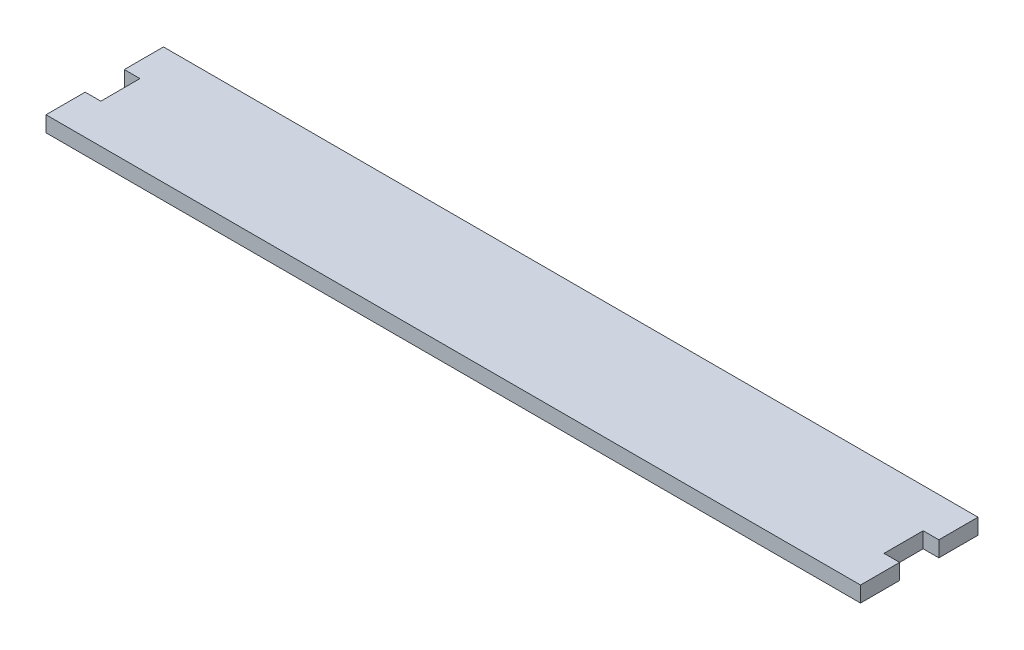
ISO-10303-21;
HEADER;
FILE_DESCRIPTION(('STEP AP214'),'2;1');
FILE_NAME('part.step','',(''),(''),'','','');
FILE_SCHEMA(('AUTOMOTIVE_DESIGN { 1 0 10303 214 1 1 1 1 }'));
ENDSEC;
DATA;
#1=APPLICATION_CONTEXT('core data for automotive mechanical design processes');
#2=APPLICATION_PROTOCOL_DEFINITION('international standard','automotive_design',2000,#1);
#3=PRODUCT_CONTEXT('',#1,'mechanical');
#4=PRODUCT('Part','Part','',(#3));
#5=PRODUCT_RELATED_PRODUCT_CATEGORY('part','',(#4));
#6=PRODUCT_DEFINITION_FORMATION('','',#4);
#7=PRODUCT_DEFINITION_CONTEXT('part definition',#1,'design');
#8=PRODUCT_DEFINITION('design','',#6,#7);
#9=PRODUCT_DEFINITION_SHAPE('','',#8);
#10=(LENGTH_UNIT() NAMED_UNIT(*) SI_UNIT(.MILLI.,.METRE.));
#11=(NAMED_UNIT(*) PLANE_ANGLE_UNIT() SI_UNIT($,.RADIAN.));
#12=(NAMED_UNIT(*) SI_UNIT($,.STERADIAN.) SOLID_ANGLE_UNIT());
#13=UNCERTAINTY_MEASURE_WITH_UNIT(LENGTH_MEASURE(1.E-05),#10,'distance_accuracy_value','');
#14=(GEOMETRIC_REPRESENTATION_CONTEXT(3) GLOBAL_UNCERTAINTY_ASSIGNED_CONTEXT((#13)) GLOBAL_UNIT_ASSIGNED_CONTEXT((#10,
#11,#12)) REPRESENTATION_CONTEXT('',''));
#15=CARTESIAN_POINT('',(0.,0.,0.));
#16=DIRECTION('',(0.,0.,1.));
#17=DIRECTION('',(1.,0.,0.));
#18=AXIS2_PLACEMENT_3D('',#15,#16,#17);
#19=CARTESIAN_POINT('',(204.,4.,-15.));
#20=DIRECTION('',(1.,0.,0.));
#21=DIRECTION('',(0.,0.,-1.));
#22=AXIS2_PLACEMENT_3D('',#19,#20,#21);
#23=PLANE('',#22);
#24=DIRECTION('',(0.,0.,1.));
#25=VECTOR('',#24,1.);
#26=CARTESIAN_POINT('',(204.,0.,-15.));
#27=LINE('',#26,#25);
#28=CARTESIAN_POINT('',(204.,0.,-30.));
#29=VERTEX_POINT('',#28);
#30=CARTESIAN_POINT('',(204.,0.,-20.));
#31=VERTEX_POINT('',#30);
#32=EDGE_CURVE('E150',#29,#31,#27,.T.);
#33=ORIENTED_EDGE('',*,*,#32,.F.);
#34=DIRECTION('',(0.,-1.,0.));
#35=VECTOR('',#34,1.);
#36=CARTESIAN_POINT('',(204.,4.,-30.));
#37=LINE('',#36,#35);
#38=CARTESIAN_POINT('',(204.,4.,-30.));
#39=VERTEX_POINT('',#38);
#40=EDGE_CURVE('E11',#39,#29,#37,.T.);
#41=ORIENTED_EDGE('',*,*,#40,.F.);
#42=DIRECTION('',(0.,0.,1.));
#43=VECTOR('',#42,1.);
#44=CARTESIAN_POINT('',(204.,4.,-15.));
#45=LINE('',#44,#43);
#46=CARTESIAN_POINT('',(204.,4.,-20.));
#47=VERTEX_POINT('',#46);
#48=EDGE_CURVE('E181',#39,#47,#45,.T.);
#49=ORIENTED_EDGE('',*,*,#48,.T.);
#50=DIRECTION('',(0.,-1.,0.));
#51=VECTOR('',#50,1.);
#52=CARTESIAN_POINT('',(204.,4.,-20.));
#53=LINE('',#52,#51);
#54=EDGE_CURVE('E94',#47,#31,#53,.T.);
#55=ORIENTED_EDGE('',*,*,#54,.T.);
#56=EDGE_LOOP('',(#33,#41,#49,#55));
#57=FACE_BOUND('',#56,.T.);
#58=ADVANCED_FACE('F32',(#57),#23,.T.);
#59=CARTESIAN_POINT('',(-63.6015694046225,4.,-30.));
#60=DIRECTION('',(0.,0.,-1.));
#61=DIRECTION('',(-1.,0.,0.));
#62=AXIS2_PLACEMENT_3D('',#59,#60,#61);
#63=PLANE('',#62);
#64=DIRECTION('',(1.,0.,0.));
#65=VECTOR('',#64,1.);
#66=CARTESIAN_POINT('',(-63.6015694046225,0.,-30.));
#67=LINE('',#66,#65);
#68=CARTESIAN_POINT('',(-4.,0.,-30.));
#69=VERTEX_POINT('',#68);
#70=EDGE_CURVE('E153',#69,#29,#67,.T.);
#71=ORIENTED_EDGE('',*,*,#70,.F.);
#72=DIRECTION('',(0.,-1.,0.));
#73=VECTOR('',#72,1.);
#74=CARTESIAN_POINT('',(-4.,4.,-30.));
#75=LINE('',#74,#73);
#76=CARTESIAN_POINT('',(-4.,4.,-30.));
#77=VERTEX_POINT('',#76);
#78=EDGE_CURVE('E40',#77,#69,#75,.T.);
#79=ORIENTED_EDGE('',*,*,#78,.F.);
#80=DIRECTION('',(1.,0.,0.));
#81=VECTOR('',#80,1.);
#82=CARTESIAN_POINT('',(-63.6015694046225,4.,-30.));
#83=LINE('',#82,#81);
#84=EDGE_CURVE('E210',#77,#39,#83,.T.);
#85=ORIENTED_EDGE('',*,*,#84,.T.);
#86=ORIENTED_EDGE('',*,*,#40,.T.);
#87=EDGE_LOOP('',(#71,#79,#85,#86));
#88=FACE_BOUND('',#87,.T.);
#89=ADVANCED_FACE('F209',(#88),#63,.T.);
#90=CARTESIAN_POINT('',(-4.,4.,-15.));
#91=DIRECTION('',(1.,0.,0.));
#92=DIRECTION('',(0.,0.,-1.));
#93=AXIS2_PLACEMENT_3D('',#90,#91,#92);
#94=PLANE('',#93);
#95=DIRECTION('',(0.,0.,1.));
#96=VECTOR('',#95,1.);
#97=CARTESIAN_POINT('',(-4.,0.,-15.));
#98=LINE('',#97,#96);
#99=CARTESIAN_POINT('',(-4.,0.,-20.));
#100=VERTEX_POINT('',#99);
#101=EDGE_CURVE('E156',#69,#100,#98,.T.);
#102=ORIENTED_EDGE('',*,*,#101,.T.);
#103=DIRECTION('',(0.,-1.,0.));
#104=VECTOR('',#103,1.);
#105=CARTESIAN_POINT('',(-4.,4.,-20.));
#106=LINE('',#105,#104);
#107=CARTESIAN_POINT('',(-4.,4.,-20.));
#108=VERTEX_POINT('',#107);
#109=EDGE_CURVE('E195',#108,#100,#106,.T.);
#110=ORIENTED_EDGE('',*,*,#109,.F.);
#111=DIRECTION('',(0.,0.,1.));
#112=VECTOR('',#111,1.);
#113=CARTESIAN_POINT('',(-4.,4.,-15.));
#114=LINE('',#113,#112);
#115=EDGE_CURVE('E201',#77,#108,#114,.T.);
#116=ORIENTED_EDGE('',*,*,#115,.F.);
#117=ORIENTED_EDGE('',*,*,#78,.T.);
#118=EDGE_LOOP('',(#102,#110,#116,#117));
#119=FACE_BOUND('',#118,.T.);
#120=ADVANCED_FACE('F199',(#119),#94,.F.);
#121=CARTESIAN_POINT('',(-63.6015694046225,4.,-20.));
#122=DIRECTION('',(0.,0.,1.));
#123=DIRECTION('',(1.,0.,0.));
#124=AXIS2_PLACEMENT_3D('',#121,#122,#123);
#125=PLANE('',#124);
#126=DIRECTION('',(-1.,0.,0.));
#127=VECTOR('',#126,1.);
#128=CARTESIAN_POINT('',(-63.6015694046225,0.,-20.));
#129=LINE('',#128,#127);
#130=CARTESIAN_POINT('',(0.,0.,-20.));
#131=VERTEX_POINT('',#130);
#132=EDGE_CURVE('E159',#131,#100,#129,.T.);
#133=ORIENTED_EDGE('',*,*,#132,.F.);
#134=DIRECTION('',(0.,-1.,0.));
#135=VECTOR('',#134,1.);
#136=CARTESIAN_POINT('',(0.,4.,-20.));
#137=LINE('',#136,#135);
#138=CARTESIAN_POINT('',(0.,4.,-20.));
#139=VERTEX_POINT('',#138);
#140=EDGE_CURVE('E193',#139,#131,#137,.T.);
#141=ORIENTED_EDGE('',*,*,#140,.F.);
#142=DIRECTION('',(-1.,0.,0.));
#143=VECTOR('',#142,1.);
#144=CARTESIAN_POINT('',(-63.6015694046225,4.,-20.));
#145=LINE('',#144,#143);
#146=EDGE_CURVE('E218',#139,#108,#145,.T.);
#147=ORIENTED_EDGE('',*,*,#146,.T.);
#148=ORIENTED_EDGE('',*,*,#109,.T.);
#149=EDGE_LOOP('',(#133,#141,#147,#148));
#150=FACE_BOUND('',#149,.T.);
#151=ADVANCED_FACE('F258',(#150),#125,.T.);
#152=CARTESIAN_POINT('',(0.,4.,-15.));
#153=DIRECTION('',(-1.,0.,0.));
#154=DIRECTION('',(0.,0.,1.));
#155=AXIS2_PLACEMENT_3D('',#152,#153,#154);
#156=PLANE('',#155);
#157=DIRECTION('',(0.,0.,-1.));
#158=VECTOR('',#157,1.);
#159=CARTESIAN_POINT('',(0.,0.,-15.));
#160=LINE('',#159,#158);
#161=CARTESIAN_POINT('',(0.,0.,-10.));
#162=VERTEX_POINT('',#161);
#163=EDGE_CURVE('E162',#162,#131,#160,.T.);
#164=ORIENTED_EDGE('',*,*,#163,.F.);
#165=DIRECTION('',(0.,-1.,0.));
#166=VECTOR('',#165,1.);
#167=CARTESIAN_POINT('',(0.,4.,-10.));
#168=LINE('',#167,#166);
#169=CARTESIAN_POINT('',(0.,4.,-10.));
#170=VERTEX_POINT('',#169);
#171=EDGE_CURVE('E191',#170,#162,#168,.T.);
#172=ORIENTED_EDGE('',*,*,#171,.F.);
#173=DIRECTION('',(0.,0.,-1.));
#174=VECTOR('',#173,1.);
#175=CARTESIAN_POINT('',(0.,4.,-15.));
#176=LINE('',#175,#174);
#177=EDGE_CURVE('E221',#170,#139,#176,.T.);
#178=ORIENTED_EDGE('',*,*,#177,.T.);
#179=ORIENTED_EDGE('',*,*,#140,.T.);
#180=EDGE_LOOP('',(#164,#172,#178,#179));
#181=FACE_BOUND('',#180,.T.);
#182=ADVANCED_FACE('F263',(#181),#156,.T.);
#183=CARTESIAN_POINT('',(-63.6015694046225,4.,-9.99999999999997));
#184=DIRECTION('',(0.,0.,1.));
#185=DIRECTION('',(1.,0.,0.));
#186=AXIS2_PLACEMENT_3D('',#183,#184,#185);
#187=PLANE('',#186);
#188=DIRECTION('',(-1.,0.,0.));
#189=VECTOR('',#188,1.);
#190=CARTESIAN_POINT('',(-63.6015694046225,0.,-9.99999999999997));
#191=LINE('',#190,#189);
#192=CARTESIAN_POINT('',(-4.,0.,-10.));
#193=VERTEX_POINT('',#192);
#194=EDGE_CURVE('E165',#162,#193,#191,.T.);
#195=ORIENTED_EDGE('',*,*,#194,.T.);
#196=DIRECTION('',(0.,-1.,0.));
#197=VECTOR('',#196,1.);
#198=CARTESIAN_POINT('',(-4.,4.,-10.));
#199=LINE('',#198,#197);
#200=CARTESIAN_POINT('',(-4.,4.,-10.));
#201=VERTEX_POINT('',#200);
#202=EDGE_CURVE('E189',#201,#193,#199,.T.);
#203=ORIENTED_EDGE('',*,*,#202,.F.);
#204=DIRECTION('',(-1.,0.,0.));
#205=VECTOR('',#204,1.);
#206=CARTESIAN_POINT('',(-63.6015694046225,4.,-9.99999999999997));
#207=LINE('',#206,#205);
#208=EDGE_CURVE('E224',#170,#201,#207,.T.);
#209=ORIENTED_EDGE('',*,*,#208,.F.);
#210=ORIENTED_EDGE('',*,*,#171,.T.);
#211=EDGE_LOOP('',(#195,#203,#209,#210));
#212=FACE_BOUND('',#211,.T.);
#213=ADVANCED_FACE('F267',(#212),#187,.F.);
#214=CARTESIAN_POINT('',(-4.,4.,-15.));
#215=DIRECTION('',(-1.,0.,0.));
#216=DIRECTION('',(0.,0.,1.));
#217=AXIS2_PLACEMENT_3D('',#214,#215,#216);
#218=PLANE('',#217);
#219=DIRECTION('',(0.,0.,-1.));
#220=VECTOR('',#219,1.);
#221=CARTESIAN_POINT('',(-4.,0.,-15.));
#222=LINE('',#221,#220);
#223=CARTESIAN_POINT('',(-4.,0.,0.));
#224=VERTEX_POINT('',#223);
#225=EDGE_CURVE('E168',#224,#193,#222,.T.);
#226=ORIENTED_EDGE('',*,*,#225,.F.);
#227=DIRECTION('',(0.,-1.,0.));
#228=VECTOR('',#227,1.);
#229=CARTESIAN_POINT('',(-4.,4.,0.));
#230=LINE('',#229,#228);
#231=CARTESIAN_POINT('',(-4.,4.,0.));
#232=VERTEX_POINT('',#231);
#233=EDGE_CURVE('E187',#232,#224,#230,.T.);
#234=ORIENTED_EDGE('',*,*,#233,.F.);
#235=DIRECTION('',(0.,0.,-1.));
#236=VECTOR('',#235,1.);
#237=CARTESIAN_POINT('',(-4.,4.,-15.));
#238=LINE('',#237,#236);
#239=EDGE_CURVE('E226',#232,#201,#238,.T.);
#240=ORIENTED_EDGE('',*,*,#239,.T.);
#241=ORIENTED_EDGE('',*,*,#202,.T.);
#242=EDGE_LOOP('',(#226,#234,#240,#241));
#243=FACE_BOUND('',#242,.T.);
#244=ADVANCED_FACE('F238',(#243),#218,.T.);
#245=CARTESIAN_POINT('',(-63.6015694046225,4.,0.));
#246=DIRECTION('',(0.,0.,1.));
#247=DIRECTION('',(1.,0.,0.));
#248=AXIS2_PLACEMENT_3D('',#245,#246,#247);
#249=PLANE('',#248);
#250=DIRECTION('',(-1.,0.,0.));
#251=VECTOR('',#250,1.);
#252=CARTESIAN_POINT('',(-63.6015694046225,0.,0.));
#253=LINE('',#252,#251);
#254=CARTESIAN_POINT('',(204.,0.,0.));
#255=VERTEX_POINT('',#254);
#256=EDGE_CURVE('E171',#255,#224,#253,.T.);
#257=ORIENTED_EDGE('',*,*,#256,.F.);
#258=DIRECTION('',(0.,-1.,0.));
#259=VECTOR('',#258,1.);
#260=CARTESIAN_POINT('',(204.,4.,0.));
#261=LINE('',#260,#259);
#262=CARTESIAN_POINT('',(204.,4.,0.));
#263=VERTEX_POINT('',#262);
#264=EDGE_CURVE('E185',#263,#255,#261,.T.);
#265=ORIENTED_EDGE('',*,*,#264,.F.);
#266=DIRECTION('',(-1.,0.,0.));
#267=VECTOR('',#266,1.);
#268=CARTESIAN_POINT('',(-63.6015694046225,4.,0.));
#269=LINE('',#268,#267);
#270=EDGE_CURVE('E145',#263,#232,#269,.T.);
#271=ORIENTED_EDGE('',*,*,#270,.T.);
#272=ORIENTED_EDGE('',*,*,#233,.T.);
#273=EDGE_LOOP('',(#257,#265,#271,#272));
#274=FACE_BOUND('',#273,.T.);
#275=ADVANCED_FACE('F231',(#274),#249,.T.);
#276=CARTESIAN_POINT('',(204.,4.,-15.));
#277=DIRECTION('',(-1.,0.,0.));
#278=DIRECTION('',(0.,0.,1.));
#279=AXIS2_PLACEMENT_3D('',#276,#277,#278);
#280=PLANE('',#279);
#281=DIRECTION('',(0.,0.,-1.));
#282=VECTOR('',#281,1.);
#283=CARTESIAN_POINT('',(204.,0.,-15.));
#284=LINE('',#283,#282);
#285=CARTESIAN_POINT('',(204.,0.,-10.));
#286=VERTEX_POINT('',#285);
#287=EDGE_CURVE('E174',#255,#286,#284,.T.);
#288=ORIENTED_EDGE('',*,*,#287,.T.);
#289=DIRECTION('',(0.,-1.,0.));
#290=VECTOR('',#289,1.);
#291=CARTESIAN_POINT('',(204.,4.,-10.));
#292=LINE('',#291,#290);
#293=CARTESIAN_POINT('',(204.,4.,-10.));
#294=VERTEX_POINT('',#293);
#295=EDGE_CURVE('E133',#294,#286,#292,.T.);
#296=ORIENTED_EDGE('',*,*,#295,.F.);
#297=DIRECTION('',(0.,0.,-1.));
#298=VECTOR('',#297,1.);
#299=CARTESIAN_POINT('',(204.,4.,-15.));
#300=LINE('',#299,#298);
#301=EDGE_CURVE('E142',#263,#294,#300,.T.);
#302=ORIENTED_EDGE('',*,*,#301,.F.);
#303=ORIENTED_EDGE('',*,*,#264,.T.);
#304=EDGE_LOOP('',(#288,#296,#302,#303));
#305=FACE_BOUND('',#304,.T.);
#306=ADVANCED_FACE('F242',(#305),#280,.F.);
#307=CARTESIAN_POINT('',(-63.6015694046225,4.,-10.));
#308=DIRECTION('',(0.,0.,-1.));
#309=DIRECTION('',(-1.,0.,0.));
#310=AXIS2_PLACEMENT_3D('',#307,#308,#309);
#311=PLANE('',#310);
#312=DIRECTION('',(1.,0.,0.));
#313=VECTOR('',#312,1.);
#314=CARTESIAN_POINT('',(-63.6015694046225,0.,-10.));
#315=LINE('',#314,#313);
#316=CARTESIAN_POINT('',(200.,0.,-10.));
#317=VERTEX_POINT('',#316);
#318=EDGE_CURVE('E132',#317,#286,#315,.T.);
#319=ORIENTED_EDGE('',*,*,#318,.F.);
#320=DIRECTION('',(0.,-1.,0.));
#321=VECTOR('',#320,1.);
#322=CARTESIAN_POINT('',(200.,4.,-10.));
#323=LINE('',#322,#321);
#324=CARTESIAN_POINT('',(200.,4.,-10.));
#325=VERTEX_POINT('',#324);
#326=EDGE_CURVE('E126',#325,#317,#323,.T.);
#327=ORIENTED_EDGE('',*,*,#326,.F.);
#328=DIRECTION('',(1.,0.,0.));
#329=VECTOR('',#328,1.);
#330=CARTESIAN_POINT('',(-63.6015694046225,4.,-10.));
#331=LINE('',#330,#329);
#332=EDGE_CURVE('E130',#325,#294,#331,.T.);
#333=ORIENTED_EDGE('',*,*,#332,.T.);
#334=ORIENTED_EDGE('',*,*,#295,.T.);
#335=EDGE_LOOP('',(#319,#327,#333,#334));
#336=FACE_BOUND('',#335,.T.);
#337=ADVANCED_FACE('F128',(#336),#311,.T.);
#338=CARTESIAN_POINT('',(200.,4.,-15.));
#339=DIRECTION('',(-1.,0.,0.));
#340=DIRECTION('',(0.,0.,1.));
#341=AXIS2_PLACEMENT_3D('',#338,#339,#340);
#342=PLANE('',#341);
#343=DIRECTION('',(0.,0.,-1.));
#344=VECTOR('',#343,1.);
#345=CARTESIAN_POINT('',(200.,0.,-15.));
#346=LINE('',#345,#344);
#347=CARTESIAN_POINT('',(200.,0.,-20.));
#348=VERTEX_POINT('',#347);
#349=EDGE_CURVE('E87',#317,#348,#346,.T.);
#350=ORIENTED_EDGE('',*,*,#349,.T.);
#351=DIRECTION('',(0.,-1.,0.));
#352=VECTOR('',#351,1.);
#353=CARTESIAN_POINT('',(200.,4.,-20.));
#354=LINE('',#353,#352);
#355=CARTESIAN_POINT('',(200.,4.,-20.));
#356=VERTEX_POINT('',#355);
#357=EDGE_CURVE('E134',#356,#348,#354,.T.);
#358=ORIENTED_EDGE('',*,*,#357,.F.);
#359=DIRECTION('',(0.,0.,-1.));
#360=VECTOR('',#359,1.);
#361=CARTESIAN_POINT('',(200.,4.,-15.));
#362=LINE('',#361,#360);
#363=EDGE_CURVE('E136',#325,#356,#362,.T.);
#364=ORIENTED_EDGE('',*,*,#363,.F.);
#365=ORIENTED_EDGE('',*,*,#326,.T.);
#366=EDGE_LOOP('',(#350,#358,#364,#365));
#367=FACE_BOUND('',#366,.T.);
#368=ADVANCED_FACE('F137',(#367),#342,.F.);
#369=CARTESIAN_POINT('',(-63.6015694046225,4.,-20.));
#370=DIRECTION('',(0.,0.,-1.));
#371=DIRECTION('',(-1.,0.,0.));
#372=AXIS2_PLACEMENT_3D('',#369,#370,#371);
#373=PLANE('',#372);
#374=DIRECTION('',(1.,0.,0.));
#375=VECTOR('',#374,1.);
#376=CARTESIAN_POINT('',(-63.6015694046225,0.,-20.));
#377=LINE('',#376,#375);
#378=EDGE_CURVE('E179',#348,#31,#377,.T.);
#379=ORIENTED_EDGE('',*,*,#378,.T.);
#380=ORIENTED_EDGE('',*,*,#54,.F.);
#381=DIRECTION('',(1.,0.,0.));
#382=VECTOR('',#381,1.);
#383=CARTESIAN_POINT('',(-63.6015694046225,4.,-20.));
#384=LINE('',#383,#382);
#385=EDGE_CURVE('E48',#356,#47,#384,.T.);
#386=ORIENTED_EDGE('',*,*,#385,.F.);
#387=ORIENTED_EDGE('',*,*,#357,.T.);
#388=EDGE_LOOP('',(#379,#380,#386,#387));
#389=FACE_BOUND('',#388,.T.);
#390=ADVANCED_FACE('F213',(#389),#373,.F.);
#391=CARTESIAN_POINT('',(-63.6015694046225,4.,-15.));
#392=DIRECTION('',(0.,1.,0.));
#393=DIRECTION('',(0.,0.,1.));
#394=AXIS2_PLACEMENT_3D('',#391,#392,#393);
#395=PLANE('',#394);
#396=ORIENTED_EDGE('',*,*,#48,.F.);
#397=ORIENTED_EDGE('',*,*,#84,.F.);
#398=ORIENTED_EDGE('',*,*,#115,.T.);
#399=ORIENTED_EDGE('',*,*,#146,.F.);
#400=ORIENTED_EDGE('',*,*,#177,.F.);
#401=ORIENTED_EDGE('',*,*,#208,.T.);
#402=ORIENTED_EDGE('',*,*,#239,.F.);
#403=ORIENTED_EDGE('',*,*,#270,.F.);
#404=ORIENTED_EDGE('',*,*,#301,.T.);
#405=ORIENTED_EDGE('',*,*,#332,.F.);
#406=ORIENTED_EDGE('',*,*,#363,.T.);
#407=ORIENTED_EDGE('',*,*,#385,.T.);
#408=EDGE_LOOP('',(#396,#397,#398,#399,#400,#401,#402,#403,#404,#405,#406,#407));
#409=FACE_BOUND('',#408,.T.);
#410=ADVANCED_FACE('F139',(#409),#395,.T.);
#411=CARTESIAN_POINT('',(-63.6015694046225,0.,-15.));
#412=DIRECTION('',(0.,1.,0.));
#413=DIRECTION('',(0.,0.,1.));
#414=AXIS2_PLACEMENT_3D('',#411,#412,#413);
#415=PLANE('',#414);
#416=ORIENTED_EDGE('',*,*,#32,.T.);
#417=ORIENTED_EDGE('',*,*,#378,.F.);
#418=ORIENTED_EDGE('',*,*,#349,.F.);
#419=ORIENTED_EDGE('',*,*,#318,.T.);
#420=ORIENTED_EDGE('',*,*,#287,.F.);
#421=ORIENTED_EDGE('',*,*,#256,.T.);
#422=ORIENTED_EDGE('',*,*,#225,.T.);
#423=ORIENTED_EDGE('',*,*,#194,.F.);
#424=ORIENTED_EDGE('',*,*,#163,.T.);
#425=ORIENTED_EDGE('',*,*,#132,.T.);
#426=ORIENTED_EDGE('',*,*,#101,.F.);
#427=ORIENTED_EDGE('',*,*,#70,.T.);
#428=EDGE_LOOP('',(#416,#417,#418,#419,#420,#421,#422,#423,#424,#425,#426,#427));
#429=FACE_BOUND('',#428,.T.);
#430=ADVANCED_FACE('F207',(#429),#415,.F.);
#431=CLOSED_SHELL('',(#58,#89,#120,#151,#182,#213,#244,#275,#306,#337,#368,#390,#410,#430));
#432=MANIFOLD_SOLID_BREP('B2',#431);
#433=ADVANCED_BREP_SHAPE_REPRESENTATION('',(#18,#432),#14);
#434=SHAPE_DEFINITION_REPRESENTATION(#9,#433);
ENDSEC;
END-ISO-10303-21;
